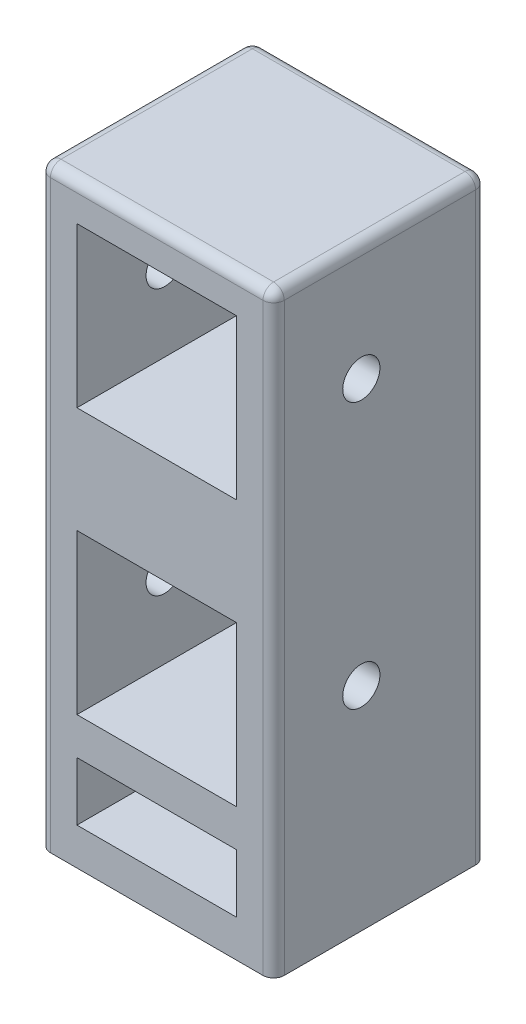
ISO-10303-21;
HEADER;
FILE_DESCRIPTION(('STEP AP214'),'2;1');
FILE_NAME('part.step','',(''),(''),'','','');
FILE_SCHEMA(('AUTOMOTIVE_DESIGN { 1 0 10303 214 1 1 1 1 }'));
ENDSEC;
DATA;
#1=APPLICATION_CONTEXT('core data for automotive mechanical design processes');
#2=APPLICATION_PROTOCOL_DEFINITION('international standard','automotive_design',2000,#1);
#3=PRODUCT_CONTEXT('',#1,'mechanical');
#4=PRODUCT('Part','Part','',(#3));
#5=PRODUCT_RELATED_PRODUCT_CATEGORY('part','',(#4));
#6=PRODUCT_DEFINITION_FORMATION('','',#4);
#7=PRODUCT_DEFINITION_CONTEXT('part definition',#1,'design');
#8=PRODUCT_DEFINITION('design','',#6,#7);
#9=PRODUCT_DEFINITION_SHAPE('','',#8);
#10=(LENGTH_UNIT() NAMED_UNIT(*) SI_UNIT(.MILLI.,.METRE.));
#11=(NAMED_UNIT(*) PLANE_ANGLE_UNIT() SI_UNIT($,.RADIAN.));
#12=(NAMED_UNIT(*) SI_UNIT($,.STERADIAN.) SOLID_ANGLE_UNIT());
#13=UNCERTAINTY_MEASURE_WITH_UNIT(LENGTH_MEASURE(1.E-05),#10,'distance_accuracy_value','');
#14=(GEOMETRIC_REPRESENTATION_CONTEXT(3) GLOBAL_UNCERTAINTY_ASSIGNED_CONTEXT((#13)) GLOBAL_UNIT_ASSIGNED_CONTEXT((#10,
#11,#12)) REPRESENTATION_CONTEXT('',''));
#15=CARTESIAN_POINT('',(0.,0.,0.));
#16=DIRECTION('',(0.,0.,1.));
#17=DIRECTION('',(1.,0.,0.));
#18=AXIS2_PLACEMENT_3D('',#15,#16,#17);
#19=CARTESIAN_POINT('',(0.,0.,20.));
#20=DIRECTION('',(0.,0.,1.));
#21=DIRECTION('',(1.,0.,0.));
#22=AXIS2_PLACEMENT_3D('',#19,#20,#21);
#23=PLANE('',#22);
#24=DIRECTION('',(0.,-1.,0.));
#25=VECTOR('',#24,1.);
#26=CARTESIAN_POINT('',(-21.596172604143,-4.66605227381946,20.));
#27=LINE('',#26,#25);
#28=CARTESIAN_POINT('',(-21.596172604143,-4.66605227381946,20.));
#29=VERTEX_POINT('',#28);
#30=CARTESIAN_POINT('',(-21.596172604143,-10.1660522738195,20.));
#31=VERTEX_POINT('',#30);
#32=EDGE_CURVE('E205',#29,#31,#27,.T.);
#33=ORIENTED_EDGE('',*,*,#32,.F.);
#34=DIRECTION('',(-1.,0.,0.));
#35=VECTOR('',#34,1.);
#36=CARTESIAN_POINT('',(-21.596172604143,-4.66605227381946,20.));
#37=LINE('',#36,#35);
#38=CARTESIAN_POINT('',(-6.59617260414296,-4.66605227381946,20.));
#39=VERTEX_POINT('',#38);
#40=EDGE_CURVE('E209',#39,#29,#37,.T.);
#41=ORIENTED_EDGE('',*,*,#40,.F.);
#42=DIRECTION('',(0.,1.,0.));
#43=VECTOR('',#42,1.);
#44=CARTESIAN_POINT('',(-6.59617260414296,-4.66605227381946,20.));
#45=LINE('',#44,#43);
#46=CARTESIAN_POINT('',(-6.59617260414296,-10.1660522738195,20.));
#47=VERTEX_POINT('',#46);
#48=EDGE_CURVE('E189',#47,#39,#45,.T.);
#49=ORIENTED_EDGE('',*,*,#48,.F.);
#50=DIRECTION('',(1.,0.,0.));
#51=VECTOR('',#50,1.);
#52=CARTESIAN_POINT('',(-21.596172604143,-10.1660522738195,20.));
#53=LINE('',#52,#51);
#54=EDGE_CURVE('E200',#31,#47,#53,.T.);
#55=ORIENTED_EDGE('',*,*,#54,.F.);
#56=EDGE_LOOP('',(#33,#41,#49,#55));
#57=FACE_BOUND('',#56,.T.);
#58=DIRECTION('',(0.,-1.,0.));
#59=VECTOR('',#58,1.);
#60=CARTESIAN_POINT('',(-21.596172604143,13.8339477261805,20.));
#61=LINE('',#60,#59);
#62=CARTESIAN_POINT('',(-21.596172604143,13.8339477261805,20.));
#63=VERTEX_POINT('',#62);
#64=CARTESIAN_POINT('',(-21.596172604143,-1.16605227381946,20.));
#65=VERTEX_POINT('',#64);
#66=EDGE_CURVE('E220',#63,#65,#61,.T.);
#67=ORIENTED_EDGE('',*,*,#66,.F.);
#68=DIRECTION('',(-1.,0.,0.));
#69=VECTOR('',#68,1.);
#70=CARTESIAN_POINT('',(-21.596172604143,13.8339477261805,20.));
#71=LINE('',#70,#69);
#72=CARTESIAN_POINT('',(-6.59617260414296,13.8339477261805,20.));
#73=VERTEX_POINT('',#72);
#74=EDGE_CURVE('E237',#73,#63,#71,.T.);
#75=ORIENTED_EDGE('',*,*,#74,.F.);
#76=DIRECTION('',(0.,1.,0.));
#77=VECTOR('',#76,1.);
#78=CARTESIAN_POINT('',(-6.59617260414296,13.8339477261805,20.));
#79=LINE('',#78,#77);
#80=CARTESIAN_POINT('',(-6.59617260414296,-1.16605227381946,20.));
#81=VERTEX_POINT('',#80);
#82=EDGE_CURVE('E234',#81,#73,#79,.T.);
#83=ORIENTED_EDGE('',*,*,#82,.F.);
#84=DIRECTION('',(1.,0.,0.));
#85=VECTOR('',#84,1.);
#86=CARTESIAN_POINT('',(-21.596172604143,-1.16605227381946,20.));
#87=LINE('',#86,#85);
#88=EDGE_CURVE('E231',#65,#81,#87,.T.);
#89=ORIENTED_EDGE('',*,*,#88,.F.);
#90=EDGE_LOOP('',(#67,#75,#83,#89));
#91=FACE_BOUND('',#90,.T.);
#92=DIRECTION('',(1.,0.,0.));
#93=VECTOR('',#92,1.);
#94=CARTESIAN_POINT('',(-25.096172604143,-13.6660522738195,20.));
#95=LINE('',#94,#93);
#96=CARTESIAN_POINT('',(-24.096172604143,-13.6660522738195,20.));
#97=VERTEX_POINT('',#96);
#98=CARTESIAN_POINT('',(-4.09617260414296,-13.6660522738195,20.));
#99=VERTEX_POINT('',#98);
#100=EDGE_CURVE('E281',#97,#99,#95,.T.);
#101=ORIENTED_EDGE('',*,*,#100,.T.);
#102=DIRECTION('',(0.,1.,0.));
#103=VECTOR('',#102,1.);
#104=CARTESIAN_POINT('',(-4.09617260414297,42.3339477261805,20.));
#105=LINE('',#104,#103);
#106=CARTESIAN_POINT('',(-4.09617260414297,41.3339477261805,20.));
#107=VERTEX_POINT('',#106);
#108=EDGE_CURVE('E317',#99,#107,#105,.T.);
#109=ORIENTED_EDGE('',*,*,#108,.T.);
#110=DIRECTION('',(-1.,0.,0.));
#111=VECTOR('',#110,1.);
#112=CARTESIAN_POINT('',(-25.096172604143,41.3339477261805,20.));
#113=LINE('',#112,#111);
#114=CARTESIAN_POINT('',(-24.096172604143,41.3339477261805,20.));
#115=VERTEX_POINT('',#114);
#116=EDGE_CURVE('E315',#107,#115,#113,.T.);
#117=ORIENTED_EDGE('',*,*,#116,.T.);
#118=DIRECTION('',(0.,-1.,0.));
#119=VECTOR('',#118,1.);
#120=CARTESIAN_POINT('',(-24.096172604143,-13.6660522738195,20.));
#121=LINE('',#120,#119);
#122=EDGE_CURVE('E313',#115,#97,#121,.T.);
#123=ORIENTED_EDGE('',*,*,#122,.T.);
#124=EDGE_LOOP('',(#101,#109,#117,#123));
#125=FACE_BOUND('',#124,.T.);
#126=DIRECTION('',(1.,0.,0.));
#127=VECTOR('',#126,1.);
#128=CARTESIAN_POINT('',(-21.596172604143,23.8339477261805,20.));
#129=LINE('',#128,#127);
#130=CARTESIAN_POINT('',(-21.596172604143,23.8339477261805,20.));
#131=VERTEX_POINT('',#130);
#132=CARTESIAN_POINT('',(-6.59617260414296,23.8339477261805,20.));
#133=VERTEX_POINT('',#132);
#134=EDGE_CURVE('E252',#131,#133,#129,.T.);
#135=ORIENTED_EDGE('',*,*,#134,.F.);
#136=DIRECTION('',(0.,-1.,0.));
#137=VECTOR('',#136,1.);
#138=CARTESIAN_POINT('',(-21.596172604143,38.8339477261805,20.));
#139=LINE('',#138,#137);
#140=CARTESIAN_POINT('',(-21.596172604143,38.8339477261805,20.));
#141=VERTEX_POINT('',#140);
#142=EDGE_CURVE('E250',#141,#131,#139,.T.);
#143=ORIENTED_EDGE('',*,*,#142,.F.);
#144=DIRECTION('',(-1.,0.,0.));
#145=VECTOR('',#144,1.);
#146=CARTESIAN_POINT('',(-21.596172604143,38.8339477261805,20.));
#147=LINE('',#146,#145);
#148=CARTESIAN_POINT('',(-6.59617260414297,38.8339477261805,20.));
#149=VERTEX_POINT('',#148);
#150=EDGE_CURVE('E258',#149,#141,#147,.T.);
#151=ORIENTED_EDGE('',*,*,#150,.F.);
#152=DIRECTION('',(0.,1.,0.));
#153=VECTOR('',#152,1.);
#154=CARTESIAN_POINT('',(-6.59617260414297,38.8339477261805,20.));
#155=LINE('',#154,#153);
#156=EDGE_CURVE('E255',#133,#149,#155,.T.);
#157=ORIENTED_EDGE('',*,*,#156,.F.);
#158=EDGE_LOOP('',(#135,#143,#151,#157));
#159=FACE_BOUND('',#158,.T.);
#160=ADVANCED_FACE('F35',(#57,#91,#125,#159),#23,.T.);
#161=CARTESIAN_POINT('',(0.,0.,0.));
#162=DIRECTION('',(0.,0.,1.));
#163=DIRECTION('',(1.,0.,0.));
#164=AXIS2_PLACEMENT_3D('',#161,#162,#163);
#165=PLANE('',#164);
#166=DIRECTION('',(-1.,0.,0.));
#167=VECTOR('',#166,1.);
#168=CARTESIAN_POINT('',(0.,41.3339477261805,0.));
#169=LINE('',#168,#167);
#170=CARTESIAN_POINT('',(-24.096172604143,41.3339477261805,0.));
#171=VERTEX_POINT('',#170);
#172=CARTESIAN_POINT('',(-4.09617260414297,41.3339477261805,0.));
#173=VERTEX_POINT('',#172);
#174=EDGE_CURVE('E309',#171,#173,#169,.F.);
#175=ORIENTED_EDGE('',*,*,#174,.T.);
#176=DIRECTION('',(0.,1.,0.));
#177=VECTOR('',#176,1.);
#178=CARTESIAN_POINT('',(-4.09617260414296,0.,0.));
#179=LINE('',#178,#177);
#180=CARTESIAN_POINT('',(-4.09617260414296,-13.6660522738195,0.));
#181=VERTEX_POINT('',#180);
#182=EDGE_CURVE('E311',#173,#181,#179,.F.);
#183=ORIENTED_EDGE('',*,*,#182,.T.);
#184=DIRECTION('',(1.,0.,0.));
#185=VECTOR('',#184,1.);
#186=CARTESIAN_POINT('',(-25.096172604143,-13.6660522738195,0.));
#187=LINE('',#186,#185);
#188=CARTESIAN_POINT('',(-24.096172604143,-13.6660522738195,0.));
#189=VERTEX_POINT('',#188);
#190=EDGE_CURVE('E280',#189,#181,#187,.T.);
#191=ORIENTED_EDGE('',*,*,#190,.F.);
#192=DIRECTION('',(0.,-1.,0.));
#193=VECTOR('',#192,1.);
#194=CARTESIAN_POINT('',(-24.096172604143,0.,0.));
#195=LINE('',#194,#193);
#196=EDGE_CURVE('E307',#189,#171,#195,.F.);
#197=ORIENTED_EDGE('',*,*,#196,.T.);
#198=EDGE_LOOP('',(#175,#183,#191,#197));
#199=FACE_BOUND('',#198,.T.);
#200=DIRECTION('',(0.,-1.,0.));
#201=VECTOR('',#200,1.);
#202=CARTESIAN_POINT('',(-21.596172604143,38.8339477261805,0.));
#203=LINE('',#202,#201);
#204=CARTESIAN_POINT('',(-21.596172604143,38.8339477261805,0.));
#205=VERTEX_POINT('',#204);
#206=CARTESIAN_POINT('',(-21.596172604143,23.8339477261805,0.));
#207=VERTEX_POINT('',#206);
#208=EDGE_CURVE('E249',#205,#207,#203,.T.);
#209=ORIENTED_EDGE('',*,*,#208,.T.);
#210=DIRECTION('',(1.,0.,0.));
#211=VECTOR('',#210,1.);
#212=CARTESIAN_POINT('',(-21.596172604143,23.8339477261805,0.));
#213=LINE('',#212,#211);
#214=CARTESIAN_POINT('',(-6.59617260414296,23.8339477261805,0.));
#215=VERTEX_POINT('',#214);
#216=EDGE_CURVE('E263',#207,#215,#213,.T.);
#217=ORIENTED_EDGE('',*,*,#216,.T.);
#218=DIRECTION('',(0.,1.,0.));
#219=VECTOR('',#218,1.);
#220=CARTESIAN_POINT('',(-6.59617260414297,38.8339477261805,0.));
#221=LINE('',#220,#219);
#222=CARTESIAN_POINT('',(-6.59617260414297,38.8339477261805,0.));
#223=VERTEX_POINT('',#222);
#224=EDGE_CURVE('E266',#215,#223,#221,.T.);
#225=ORIENTED_EDGE('',*,*,#224,.T.);
#226=DIRECTION('',(-1.,0.,0.));
#227=VECTOR('',#226,1.);
#228=CARTESIAN_POINT('',(-21.596172604143,38.8339477261805,0.));
#229=LINE('',#228,#227);
#230=EDGE_CURVE('E253',#223,#205,#229,.T.);
#231=ORIENTED_EDGE('',*,*,#230,.T.);
#232=EDGE_LOOP('',(#209,#217,#225,#231));
#233=FACE_BOUND('',#232,.T.);
#234=ADVANCED_FACE('F406',(#199,#233),#165,.F.);
#235=CARTESIAN_POINT('',(-25.096172604143,42.3339477261805,20.));
#236=DIRECTION('',(1.,0.,0.));
#237=DIRECTION('',(0.,0.,-1.));
#238=AXIS2_PLACEMENT_3D('',#235,#236,#237);
#239=PLANE('',#238);
#240=CARTESIAN_POINT('',(-25.096172604143,6.33394772618054,11.75));
#241=DIRECTION('',(-1.,0.,0.));
#242=DIRECTION('',(0.,0.,1.));
#243=AXIS2_PLACEMENT_3D('',#240,#241,#242);
#244=CIRCLE('',#243,1.75);
#245=CARTESIAN_POINT('',(-25.096172604143,6.33394772618054,13.5));
#246=VERTEX_POINT('',#245);
#247=EDGE_CURVE('E777',#246,#246,#244,.T.);
#248=ORIENTED_EDGE('',*,*,#247,.F.);
#249=EDGE_LOOP('',(#248));
#250=FACE_BOUND('',#249,.T.);
#251=CARTESIAN_POINT('',(-25.096172604143,31.3339477261805,11.75));
#252=DIRECTION('',(-1.,0.,0.));
#253=DIRECTION('',(0.,0.,1.));
#254=AXIS2_PLACEMENT_3D('',#251,#252,#253);
#255=CIRCLE('',#254,1.75);
#256=CARTESIAN_POINT('',(-25.096172604143,31.3339477261805,13.5));
#257=VERTEX_POINT('',#256);
#258=EDGE_CURVE('E365',#257,#257,#255,.T.);
#259=ORIENTED_EDGE('',*,*,#258,.F.);
#260=EDGE_LOOP('',(#259));
#261=FACE_BOUND('',#260,.T.);
#262=DIRECTION('',(0.,0.,-1.));
#263=VECTOR('',#262,1.);
#264=CARTESIAN_POINT('',(-25.096172604143,41.3339477261805,20.));
#265=LINE('',#264,#263);
#266=CARTESIAN_POINT('',(-25.096172604143,41.3339477261805,19.));
#267=VERTEX_POINT('',#266);
#268=CARTESIAN_POINT('',(-25.096172604143,41.3339477261805,1.));
#269=VERTEX_POINT('',#268);
#270=EDGE_CURVE('E293',#267,#269,#265,.T.);
#271=ORIENTED_EDGE('',*,*,#270,.T.);
#272=DIRECTION('',(0.,-1.,0.));
#273=VECTOR('',#272,1.);
#274=CARTESIAN_POINT('',(-25.096172604143,42.3339477261805,1.));
#275=LINE('',#274,#273);
#276=CARTESIAN_POINT('',(-25.096172604143,-13.6660522738195,1.));
#277=VERTEX_POINT('',#276);
#278=EDGE_CURVE('E296',#269,#277,#275,.T.);
#279=ORIENTED_EDGE('',*,*,#278,.T.);
#280=DIRECTION('',(0.,0.,-1.));
#281=VECTOR('',#280,1.);
#282=CARTESIAN_POINT('',(-25.096172604143,-13.6660522738195,20.));
#283=LINE('',#282,#281);
#284=CARTESIAN_POINT('',(-25.096172604143,-13.6660522738195,19.));
#285=VERTEX_POINT('',#284);
#286=EDGE_CURVE('E288',#285,#277,#283,.T.);
#287=ORIENTED_EDGE('',*,*,#286,.F.);
#288=DIRECTION('',(0.,-1.,0.));
#289=VECTOR('',#288,1.);
#290=CARTESIAN_POINT('',(-25.096172604143,42.3339477261805,19.));
#291=LINE('',#290,#289);
#292=EDGE_CURVE('E291',#285,#267,#291,.F.);
#293=ORIENTED_EDGE('',*,*,#292,.T.);
#294=EDGE_LOOP('',(#271,#279,#287,#293));
#295=FACE_BOUND('',#294,.T.);
#296=ADVANCED_FACE('F411',(#250,#261,#295),#239,.F.);
#297=CARTESIAN_POINT('',(-25.096172604143,-13.6660522738195,20.));
#298=DIRECTION('',(0.,1.,0.));
#299=DIRECTION('',(0.,0.,1.));
#300=AXIS2_PLACEMENT_3D('',#297,#298,#299);
#301=PLANE('',#300);
#302=ORIENTED_EDGE('',*,*,#190,.T.);
#303=CARTESIAN_POINT('',(-4.09617260414296,-13.6660522738195,1.));
#304=DIRECTION('',(0.,1.,0.));
#305=DIRECTION('',(0.,0.,1.));
#306=AXIS2_PLACEMENT_3D('',#303,#304,#305);
#307=CIRCLE('',#306,1.);
#308=CARTESIAN_POINT('',(-3.09617260414296,-13.6660522738195,1.));
#309=VERTEX_POINT('',#308);
#310=EDGE_CURVE('E12',#181,#309,#307,.F.);
#311=ORIENTED_EDGE('',*,*,#310,.T.);
#312=DIRECTION('',(0.,0.,-1.));
#313=VECTOR('',#312,1.);
#314=CARTESIAN_POINT('',(-3.09617260414296,-13.6660522738195,20.));
#315=LINE('',#314,#313);
#316=CARTESIAN_POINT('',(-3.09617260414296,-13.6660522738195,19.));
#317=VERTEX_POINT('',#316);
#318=EDGE_CURVE('E284',#317,#309,#315,.T.);
#319=ORIENTED_EDGE('',*,*,#318,.F.);
#320=CARTESIAN_POINT('',(-4.09617260414296,-13.6660522738195,19.));
#321=DIRECTION('',(0.,1.,0.));
#322=DIRECTION('',(0.,0.,1.));
#323=AXIS2_PLACEMENT_3D('',#320,#321,#322);
#324=CIRCLE('',#323,1.);
#325=EDGE_CURVE('E44',#317,#99,#324,.F.);
#326=ORIENTED_EDGE('',*,*,#325,.T.);
#327=ORIENTED_EDGE('',*,*,#100,.F.);
#328=CARTESIAN_POINT('',(-24.096172604143,-13.6660522738195,19.));
#329=DIRECTION('',(0.,1.,0.));
#330=DIRECTION('',(0.,0.,1.));
#331=AXIS2_PLACEMENT_3D('',#328,#329,#330);
#332=CIRCLE('',#331,1.);
#333=EDGE_CURVE('E323',#97,#285,#332,.F.);
#334=ORIENTED_EDGE('',*,*,#333,.T.);
#335=ORIENTED_EDGE('',*,*,#286,.T.);
#336=CARTESIAN_POINT('',(-24.096172604143,-13.6660522738195,1.));
#337=DIRECTION('',(0.,1.,0.));
#338=DIRECTION('',(0.,0.,1.));
#339=AXIS2_PLACEMENT_3D('',#336,#337,#338);
#340=CIRCLE('',#339,1.);
#341=EDGE_CURVE('E325',#277,#189,#340,.F.);
#342=ORIENTED_EDGE('',*,*,#341,.T.);
#343=EDGE_LOOP('',(#302,#311,#319,#326,#327,#334,#335,#342));
#344=FACE_BOUND('',#343,.T.);
#345=ADVANCED_FACE('F425',(#344),#301,.F.);
#346=CARTESIAN_POINT('',(-3.09617260414297,42.3339477261805,20.));
#347=DIRECTION('',(-1.,0.,0.));
#348=DIRECTION('',(0.,-1.,0.));
#349=AXIS2_PLACEMENT_3D('',#346,#347,#348);
#350=PLANE('',#349);
#351=CARTESIAN_POINT('',(-3.09617260414296,6.33394772618054,11.75));
#352=DIRECTION('',(-1.,0.,0.));
#353=DIRECTION('',(0.,-1.,0.));
#354=AXIS2_PLACEMENT_3D('',#351,#352,#353);
#355=CIRCLE('',#354,1.75);
#356=CARTESIAN_POINT('',(-3.09617260414296,4.58394772618054,11.75));
#357=VERTEX_POINT('',#356);
#358=EDGE_CURVE('E371',#357,#357,#355,.T.);
#359=ORIENTED_EDGE('',*,*,#358,.T.);
#360=EDGE_LOOP('',(#359));
#361=FACE_BOUND('',#360,.T.);
#362=CARTESIAN_POINT('',(-3.09617260414296,31.3339477261805,11.75));
#363=DIRECTION('',(-1.,0.,0.));
#364=DIRECTION('',(0.,-1.,0.));
#365=AXIS2_PLACEMENT_3D('',#362,#363,#364);
#366=CIRCLE('',#365,1.75);
#367=CARTESIAN_POINT('',(-3.09617260414296,29.5839477261805,11.75));
#368=VERTEX_POINT('',#367);
#369=EDGE_CURVE('E331',#368,#368,#366,.T.);
#370=ORIENTED_EDGE('',*,*,#369,.T.);
#371=EDGE_LOOP('',(#370));
#372=FACE_BOUND('',#371,.T.);
#373=ORIENTED_EDGE('',*,*,#318,.T.);
#374=DIRECTION('',(0.,1.,0.));
#375=VECTOR('',#374,1.);
#376=CARTESIAN_POINT('',(-3.09617260414297,42.3339477261805,1.));
#377=LINE('',#376,#375);
#378=CARTESIAN_POINT('',(-3.09617260414297,41.3339477261805,1.));
#379=VERTEX_POINT('',#378);
#380=EDGE_CURVE('E52',#309,#379,#377,.T.);
#381=ORIENTED_EDGE('',*,*,#380,.T.);
#382=DIRECTION('',(0.,0.,-1.));
#383=VECTOR('',#382,1.);
#384=CARTESIAN_POINT('',(-3.09617260414297,41.3339477261805,20.));
#385=LINE('',#384,#383);
#386=CARTESIAN_POINT('',(-3.09617260414297,41.3339477261805,19.));
#387=VERTEX_POINT('',#386);
#388=EDGE_CURVE('E56',#379,#387,#385,.F.);
#389=ORIENTED_EDGE('',*,*,#388,.T.);
#390=DIRECTION('',(0.,1.,0.));
#391=VECTOR('',#390,1.);
#392=CARTESIAN_POINT('',(-3.09617260414296,-13.6660522738195,19.));
#393=LINE('',#392,#391);
#394=EDGE_CURVE('E319',#387,#317,#393,.F.);
#395=ORIENTED_EDGE('',*,*,#394,.T.);
#396=EDGE_LOOP('',(#373,#381,#389,#395));
#397=FACE_BOUND('',#396,.T.);
#398=ADVANCED_FACE('F421',(#361,#372,#397),#350,.F.);
#399=CARTESIAN_POINT('',(-25.096172604143,42.3339477261805,20.));
#400=DIRECTION('',(0.,-1.,0.));
#401=DIRECTION('',(0.,0.,-1.));
#402=AXIS2_PLACEMENT_3D('',#399,#400,#401);
#403=PLANE('',#402);
#404=DIRECTION('',(-1.,0.,0.));
#405=VECTOR('',#404,1.);
#406=CARTESIAN_POINT('',(-25.096172604143,42.3339477261805,1.));
#407=LINE('',#406,#405);
#408=CARTESIAN_POINT('',(-4.09617260414297,42.3339477261805,1.));
#409=VERTEX_POINT('',#408);
#410=CARTESIAN_POINT('',(-24.096172604143,42.3339477261805,1.));
#411=VERTEX_POINT('',#410);
#412=EDGE_CURVE('E302',#409,#411,#407,.T.);
#413=ORIENTED_EDGE('',*,*,#412,.T.);
#414=DIRECTION('',(0.,0.,-1.));
#415=VECTOR('',#414,1.);
#416=CARTESIAN_POINT('',(-24.096172604143,42.3339477261805,20.));
#417=LINE('',#416,#415);
#418=CARTESIAN_POINT('',(-24.096172604143,42.3339477261805,19.));
#419=VERTEX_POINT('',#418);
#420=EDGE_CURVE('E304',#411,#419,#417,.F.);
#421=ORIENTED_EDGE('',*,*,#420,.T.);
#422=DIRECTION('',(-1.,0.,0.));
#423=VECTOR('',#422,1.);
#424=CARTESIAN_POINT('',(-3.09617260414297,42.3339477261805,19.));
#425=LINE('',#424,#423);
#426=CARTESIAN_POINT('',(-4.09617260414297,42.3339477261805,19.));
#427=VERTEX_POINT('',#426);
#428=EDGE_CURVE('E300',#419,#427,#425,.F.);
#429=ORIENTED_EDGE('',*,*,#428,.T.);
#430=DIRECTION('',(0.,0.,-1.));
#431=VECTOR('',#430,1.);
#432=CARTESIAN_POINT('',(-4.09617260414297,42.3339477261805,20.));
#433=LINE('',#432,#431);
#434=EDGE_CURVE('E298',#427,#409,#433,.T.);
#435=ORIENTED_EDGE('',*,*,#434,.T.);
#436=EDGE_LOOP('',(#413,#421,#429,#435));
#437=FACE_BOUND('',#436,.T.);
#438=ADVANCED_FACE('F418',(#437),#403,.F.);
#439=CARTESIAN_POINT('',(-21.596172604143,38.8339477261805,20.));
#440=DIRECTION('',(1.,0.,0.));
#441=DIRECTION('',(0.,1.,0.));
#442=AXIS2_PLACEMENT_3D('',#439,#440,#441);
#443=PLANE('',#442);
#444=CARTESIAN_POINT('',(-21.596172604143,31.3339477261805,11.75));
#445=DIRECTION('',(1.,0.,0.));
#446=DIRECTION('',(0.,1.,0.));
#447=AXIS2_PLACEMENT_3D('',#444,#445,#446);
#448=CIRCLE('',#447,1.75);
#449=CARTESIAN_POINT('',(-21.596172604143,33.0839477261805,11.75));
#450=VERTEX_POINT('',#449);
#451=EDGE_CURVE('E364',#450,#450,#448,.T.);
#452=ORIENTED_EDGE('',*,*,#451,.F.);
#453=EDGE_LOOP('',(#452));
#454=FACE_BOUND('',#453,.T.);
#455=ORIENTED_EDGE('',*,*,#208,.F.);
#456=DIRECTION('',(0.,0.,-1.));
#457=VECTOR('',#456,1.);
#458=CARTESIAN_POINT('',(-21.596172604143,38.8339477261805,20.));
#459=LINE('',#458,#457);
#460=EDGE_CURVE('E260',#141,#205,#459,.T.);
#461=ORIENTED_EDGE('',*,*,#460,.F.);
#462=ORIENTED_EDGE('',*,*,#142,.T.);
#463=DIRECTION('',(0.,0.,-1.));
#464=VECTOR('',#463,1.);
#465=CARTESIAN_POINT('',(-21.596172604143,23.8339477261805,20.));
#466=LINE('',#465,#464);
#467=EDGE_CURVE('E277',#131,#207,#466,.T.);
#468=ORIENTED_EDGE('',*,*,#467,.T.);
#469=EDGE_LOOP('',(#455,#461,#462,#468));
#470=FACE_BOUND('',#469,.T.);
#471=ADVANCED_FACE('F415',(#454,#470),#443,.T.);
#472=CARTESIAN_POINT('',(-21.596172604143,23.8339477261805,20.));
#473=DIRECTION('',(0.,1.,0.));
#474=DIRECTION('',(0.,0.,1.));
#475=AXIS2_PLACEMENT_3D('',#472,#473,#474);
#476=PLANE('',#475);
#477=ORIENTED_EDGE('',*,*,#216,.F.);
#478=ORIENTED_EDGE('',*,*,#467,.F.);
#479=ORIENTED_EDGE('',*,*,#134,.T.);
#480=DIRECTION('',(0.,0.,-1.));
#481=VECTOR('',#480,1.);
#482=CARTESIAN_POINT('',(-6.59617260414296,23.8339477261805,20.));
#483=LINE('',#482,#481);
#484=EDGE_CURVE('E275',#133,#215,#483,.T.);
#485=ORIENTED_EDGE('',*,*,#484,.T.);
#486=EDGE_LOOP('',(#477,#478,#479,#485));
#487=FACE_BOUND('',#486,.T.);
#488=ADVANCED_FACE('F525',(#487),#476,.T.);
#489=CARTESIAN_POINT('',(-6.59617260414297,38.8339477261805,20.));
#490=DIRECTION('',(-1.,0.,0.));
#491=DIRECTION('',(0.,-1.,0.));
#492=AXIS2_PLACEMENT_3D('',#489,#490,#491);
#493=PLANE('',#492);
#494=CARTESIAN_POINT('',(-6.59617260414297,31.3339477261805,11.75));
#495=DIRECTION('',(-1.,0.,0.));
#496=DIRECTION('',(0.,-1.,0.));
#497=AXIS2_PLACEMENT_3D('',#494,#495,#496);
#498=CIRCLE('',#497,1.75);
#499=CARTESIAN_POINT('',(-6.59617260414297,29.5839477261805,11.75));
#500=VERTEX_POINT('',#499);
#501=EDGE_CURVE('E362',#500,#500,#498,.T.);
#502=ORIENTED_EDGE('',*,*,#501,.F.);
#503=EDGE_LOOP('',(#502));
#504=FACE_BOUND('',#503,.T.);
#505=ORIENTED_EDGE('',*,*,#224,.F.);
#506=ORIENTED_EDGE('',*,*,#484,.F.);
#507=ORIENTED_EDGE('',*,*,#156,.T.);
#508=DIRECTION('',(0.,0.,-1.));
#509=VECTOR('',#508,1.);
#510=CARTESIAN_POINT('',(-6.59617260414297,38.8339477261805,20.));
#511=LINE('',#510,#509);
#512=EDGE_CURVE('E273',#149,#223,#511,.T.);
#513=ORIENTED_EDGE('',*,*,#512,.T.);
#514=EDGE_LOOP('',(#505,#506,#507,#513));
#515=FACE_BOUND('',#514,.T.);
#516=ADVANCED_FACE('F529',(#504,#515),#493,.T.);
#517=CARTESIAN_POINT('',(-21.596172604143,38.8339477261805,20.));
#518=DIRECTION('',(0.,-1.,0.));
#519=DIRECTION('',(0.,0.,-1.));
#520=AXIS2_PLACEMENT_3D('',#517,#518,#519);
#521=PLANE('',#520);
#522=ORIENTED_EDGE('',*,*,#230,.F.);
#523=ORIENTED_EDGE('',*,*,#512,.F.);
#524=ORIENTED_EDGE('',*,*,#150,.T.);
#525=ORIENTED_EDGE('',*,*,#460,.T.);
#526=EDGE_LOOP('',(#522,#523,#524,#525));
#527=FACE_BOUND('',#526,.T.);
#528=ADVANCED_FACE('F520',(#527),#521,.T.);
#529=CARTESIAN_POINT('',(-21.596172604143,13.8339477261805,-21.2132034355964));
#530=DIRECTION('',(-1.,0.,0.));
#531=DIRECTION('',(0.,-1.,0.));
#532=AXIS2_PLACEMENT_3D('',#529,#530,#531);
#533=PLANE('',#532);
#534=CARTESIAN_POINT('',(-21.5961726041429,6.33394772618054,11.75));
#535=DIRECTION('',(-1.,0.,0.));
#536=DIRECTION('',(0.,-1.,0.));
#537=AXIS2_PLACEMENT_3D('',#534,#535,#536);
#538=CIRCLE('',#537,1.75);
#539=CARTESIAN_POINT('',(-21.5961726041429,4.58394772618054,11.75));
#540=VERTEX_POINT('',#539);
#541=EDGE_CURVE('E376',#540,#540,#538,.T.);
#542=ORIENTED_EDGE('',*,*,#541,.T.);
#543=EDGE_LOOP('',(#542));
#544=FACE_BOUND('',#543,.T.);
#545=DIRECTION('',(0.,1.,0.));
#546=VECTOR('',#545,1.);
#547=CARTESIAN_POINT('',(-21.596172604143,13.8339477261805,4.5));
#548=LINE('',#547,#546);
#549=CARTESIAN_POINT('',(-21.596172604143,-1.16605227381946,4.5));
#550=VERTEX_POINT('',#549);
#551=CARTESIAN_POINT('',(-21.596172604143,13.8339477261805,4.5));
#552=VERTEX_POINT('',#551);
#553=EDGE_CURVE('E227',#550,#552,#548,.T.);
#554=ORIENTED_EDGE('',*,*,#553,.T.);
#555=DIRECTION('',(0.,0.,1.));
#556=VECTOR('',#555,1.);
#557=CARTESIAN_POINT('',(-21.596172604143,13.8339477261805,-21.2132034355964));
#558=LINE('',#557,#556);
#559=EDGE_CURVE('E225',#552,#63,#558,.T.);
#560=ORIENTED_EDGE('',*,*,#559,.T.);
#561=ORIENTED_EDGE('',*,*,#66,.T.);
#562=DIRECTION('',(0.,0.,1.));
#563=VECTOR('',#562,1.);
#564=CARTESIAN_POINT('',(-21.596172604143,-1.16605227381946,-21.2132034355964));
#565=LINE('',#564,#563);
#566=EDGE_CURVE('E240',#550,#65,#565,.T.);
#567=ORIENTED_EDGE('',*,*,#566,.F.);
#568=EDGE_LOOP('',(#554,#560,#561,#567));
#569=FACE_BOUND('',#568,.T.);
#570=ADVANCED_FACE('F538',(#544,#569),#533,.F.);
#571=CARTESIAN_POINT('',(-21.596172604143,13.8339477261805,-21.2132034355964));
#572=DIRECTION('',(0.,1.,0.));
#573=DIRECTION('',(0.,0.,1.));
#574=AXIS2_PLACEMENT_3D('',#571,#572,#573);
#575=PLANE('',#574);
#576=DIRECTION('',(1.,0.,0.));
#577=VECTOR('',#576,1.);
#578=CARTESIAN_POINT('',(-21.596172604143,13.8339477261805,4.5));
#579=LINE('',#578,#577);
#580=CARTESIAN_POINT('',(-6.59617260414296,13.8339477261805,4.5));
#581=VERTEX_POINT('',#580);
#582=EDGE_CURVE('E224',#552,#581,#579,.T.);
#583=ORIENTED_EDGE('',*,*,#582,.T.);
#584=DIRECTION('',(0.,0.,1.));
#585=VECTOR('',#584,1.);
#586=CARTESIAN_POINT('',(-6.59617260414296,13.8339477261805,-21.2132034355964));
#587=LINE('',#586,#585);
#588=EDGE_CURVE('E242',#581,#73,#587,.T.);
#589=ORIENTED_EDGE('',*,*,#588,.T.);
#590=ORIENTED_EDGE('',*,*,#74,.T.);
#591=ORIENTED_EDGE('',*,*,#559,.F.);
#592=EDGE_LOOP('',(#583,#589,#590,#591));
#593=FACE_BOUND('',#592,.T.);
#594=ADVANCED_FACE('F543',(#593),#575,.F.);
#595=CARTESIAN_POINT('',(-6.59617260414296,13.8339477261805,-21.2132034355964));
#596=DIRECTION('',(1.,0.,0.));
#597=DIRECTION('',(0.,1.,0.));
#598=AXIS2_PLACEMENT_3D('',#595,#596,#597);
#599=PLANE('',#598);
#600=CARTESIAN_POINT('',(-6.59617260414296,6.33394772618054,11.75));
#601=DIRECTION('',(1.,0.,0.));
#602=DIRECTION('',(0.,1.,0.));
#603=AXIS2_PLACEMENT_3D('',#600,#601,#602);
#604=CIRCLE('',#603,1.75);
#605=CARTESIAN_POINT('',(-6.59617260414296,8.08394772618054,11.75));
#606=VERTEX_POINT('',#605);
#607=EDGE_CURVE('E39',#606,#606,#604,.T.);
#608=ORIENTED_EDGE('',*,*,#607,.T.);
#609=EDGE_LOOP('',(#608));
#610=FACE_BOUND('',#609,.T.);
#611=DIRECTION('',(0.,-1.,0.));
#612=VECTOR('',#611,1.);
#613=CARTESIAN_POINT('',(-6.59617260414296,13.8339477261805,4.5));
#614=LINE('',#613,#612);
#615=CARTESIAN_POINT('',(-6.59617260414296,-1.16605227381946,4.5));
#616=VERTEX_POINT('',#615);
#617=EDGE_CURVE('E222',#581,#616,#614,.T.);
#618=ORIENTED_EDGE('',*,*,#617,.T.);
#619=DIRECTION('',(0.,0.,1.));
#620=VECTOR('',#619,1.);
#621=CARTESIAN_POINT('',(-6.59617260414296,-1.16605227381946,-21.2132034355964));
#622=LINE('',#621,#620);
#623=EDGE_CURVE('E244',#616,#81,#622,.T.);
#624=ORIENTED_EDGE('',*,*,#623,.T.);
#625=ORIENTED_EDGE('',*,*,#82,.T.);
#626=ORIENTED_EDGE('',*,*,#588,.F.);
#627=EDGE_LOOP('',(#618,#624,#625,#626));
#628=FACE_BOUND('',#627,.T.);
#629=ADVANCED_FACE('F549',(#610,#628),#599,.F.);
#630=CARTESIAN_POINT('',(-21.596172604143,-1.16605227381946,-21.2132034355964));
#631=DIRECTION('',(0.,-1.,0.));
#632=DIRECTION('',(0.,0.,-1.));
#633=AXIS2_PLACEMENT_3D('',#630,#631,#632);
#634=PLANE('',#633);
#635=DIRECTION('',(-1.,0.,0.));
#636=VECTOR('',#635,1.);
#637=CARTESIAN_POINT('',(-21.596172604143,-1.16605227381946,4.5));
#638=LINE('',#637,#636);
#639=EDGE_CURVE('E229',#616,#550,#638,.T.);
#640=ORIENTED_EDGE('',*,*,#639,.T.);
#641=ORIENTED_EDGE('',*,*,#566,.T.);
#642=ORIENTED_EDGE('',*,*,#88,.T.);
#643=ORIENTED_EDGE('',*,*,#623,.F.);
#644=EDGE_LOOP('',(#640,#641,#642,#643));
#645=FACE_BOUND('',#644,.T.);
#646=ADVANCED_FACE('F545',(#645),#634,.F.);
#647=CARTESIAN_POINT('',(0.,0.,4.5));
#648=DIRECTION('',(0.,0.,1.));
#649=DIRECTION('',(1.,0.,0.));
#650=AXIS2_PLACEMENT_3D('',#647,#648,#649);
#651=PLANE('',#650);
#652=ORIENTED_EDGE('',*,*,#553,.F.);
#653=ORIENTED_EDGE('',*,*,#639,.F.);
#654=ORIENTED_EDGE('',*,*,#617,.F.);
#655=ORIENTED_EDGE('',*,*,#582,.F.);
#656=EDGE_LOOP('',(#652,#653,#654,#655));
#657=FACE_BOUND('',#656,.T.);
#658=ADVANCED_FACE('F548',(#657),#651,.T.);
#659=CARTESIAN_POINT('',(-21.596172604143,-4.66605227381946,-21.2132034355964));
#660=DIRECTION('',(-1.,0.,0.));
#661=DIRECTION('',(0.,0.,1.));
#662=AXIS2_PLACEMENT_3D('',#659,#660,#661);
#663=PLANE('',#662);
#664=DIRECTION('',(0.,1.,0.));
#665=VECTOR('',#664,1.);
#666=CARTESIAN_POINT('',(-21.596172604143,-4.66605227381946,4.5));
#667=LINE('',#666,#665);
#668=CARTESIAN_POINT('',(-21.596172604143,-10.1660522738195,4.5));
#669=VERTEX_POINT('',#668);
#670=CARTESIAN_POINT('',(-21.596172604143,-4.66605227381946,4.5));
#671=VERTEX_POINT('',#670);
#672=EDGE_CURVE('E221',#669,#671,#667,.T.);
#673=ORIENTED_EDGE('',*,*,#672,.T.);
#674=DIRECTION('',(0.,0.,1.));
#675=VECTOR('',#674,1.);
#676=CARTESIAN_POINT('',(-21.596172604143,-4.66605227381946,-21.2132034355964));
#677=LINE('',#676,#675);
#678=EDGE_CURVE('E214',#671,#29,#677,.T.);
#679=ORIENTED_EDGE('',*,*,#678,.T.);
#680=ORIENTED_EDGE('',*,*,#32,.T.);
#681=DIRECTION('',(0.,0.,1.));
#682=VECTOR('',#681,1.);
#683=CARTESIAN_POINT('',(-21.596172604143,-10.1660522738195,-21.2132034355964));
#684=LINE('',#683,#682);
#685=EDGE_CURVE('E196',#669,#31,#684,.T.);
#686=ORIENTED_EDGE('',*,*,#685,.F.);
#687=EDGE_LOOP('',(#673,#679,#680,#686));
#688=FACE_BOUND('',#687,.T.);
#689=ADVANCED_FACE('F386',(#688),#663,.F.);
#690=CARTESIAN_POINT('',(-21.596172604143,-4.66605227381946,-21.2132034355964));
#691=DIRECTION('',(0.,1.,0.));
#692=DIRECTION('',(0.,0.,1.));
#693=AXIS2_PLACEMENT_3D('',#690,#691,#692);
#694=PLANE('',#693);
#695=DIRECTION('',(1.,0.,0.));
#696=VECTOR('',#695,1.);
#697=CARTESIAN_POINT('',(-21.596172604143,-4.66605227381946,4.5));
#698=LINE('',#697,#696);
#699=CARTESIAN_POINT('',(-6.59617260414296,-4.66605227381946,4.5));
#700=VERTEX_POINT('',#699);
#701=EDGE_CURVE('E383',#671,#700,#698,.T.);
#702=ORIENTED_EDGE('',*,*,#701,.T.);
#703=DIRECTION('',(0.,0.,1.));
#704=VECTOR('',#703,1.);
#705=CARTESIAN_POINT('',(-6.59617260414296,-4.66605227381946,-21.2132034355964));
#706=LINE('',#705,#704);
#707=EDGE_CURVE('E195',#700,#39,#706,.T.);
#708=ORIENTED_EDGE('',*,*,#707,.T.);
#709=ORIENTED_EDGE('',*,*,#40,.T.);
#710=ORIENTED_EDGE('',*,*,#678,.F.);
#711=EDGE_LOOP('',(#702,#708,#709,#710));
#712=FACE_BOUND('',#711,.T.);
#713=ADVANCED_FACE('F391',(#712),#694,.F.);
#714=CARTESIAN_POINT('',(-6.59617260414296,-4.66605227381946,-21.2132034355964));
#715=DIRECTION('',(1.,0.,0.));
#716=DIRECTION('',(0.,1.,0.));
#717=AXIS2_PLACEMENT_3D('',#714,#715,#716);
#718=PLANE('',#717);
#719=DIRECTION('',(0.,-1.,0.));
#720=VECTOR('',#719,1.);
#721=CARTESIAN_POINT('',(-6.59617260414296,-4.66605227381946,4.5));
#722=LINE('',#721,#720);
#723=CARTESIAN_POINT('',(-6.59617260414296,-10.1660522738195,4.5));
#724=VERTEX_POINT('',#723);
#725=EDGE_CURVE('E192',#700,#724,#722,.T.);
#726=ORIENTED_EDGE('',*,*,#725,.T.);
#727=DIRECTION('',(0.,0.,1.));
#728=VECTOR('',#727,1.);
#729=CARTESIAN_POINT('',(-6.59617260414296,-10.1660522738195,-21.2132034355964));
#730=LINE('',#729,#728);
#731=EDGE_CURVE('E184',#724,#47,#730,.T.);
#732=ORIENTED_EDGE('',*,*,#731,.T.);
#733=ORIENTED_EDGE('',*,*,#48,.T.);
#734=ORIENTED_EDGE('',*,*,#707,.F.);
#735=EDGE_LOOP('',(#726,#732,#733,#734));
#736=FACE_BOUND('',#735,.T.);
#737=ADVANCED_FACE('F186',(#736),#718,.F.);
#738=CARTESIAN_POINT('',(-21.596172604143,-10.1660522738195,-21.2132034355964));
#739=DIRECTION('',(0.,-1.,0.));
#740=DIRECTION('',(0.,0.,-1.));
#741=AXIS2_PLACEMENT_3D('',#738,#739,#740);
#742=PLANE('',#741);
#743=DIRECTION('',(-1.,0.,0.));
#744=VECTOR('',#743,1.);
#745=CARTESIAN_POINT('',(-21.596172604143,-10.1660522738195,4.5));
#746=LINE('',#745,#744);
#747=EDGE_CURVE('E218',#724,#669,#746,.T.);
#748=ORIENTED_EDGE('',*,*,#747,.T.);
#749=ORIENTED_EDGE('',*,*,#685,.T.);
#750=ORIENTED_EDGE('',*,*,#54,.T.);
#751=ORIENTED_EDGE('',*,*,#731,.F.);
#752=EDGE_LOOP('',(#748,#749,#750,#751));
#753=FACE_BOUND('',#752,.T.);
#754=ADVANCED_FACE('F201',(#753),#742,.F.);
#755=CARTESIAN_POINT('',(0.,0.,4.5));
#756=DIRECTION('',(0.,0.,1.));
#757=DIRECTION('',(1.,0.,0.));
#758=AXIS2_PLACEMENT_3D('',#755,#756,#757);
#759=PLANE('',#758);
#760=ORIENTED_EDGE('',*,*,#672,.F.);
#761=ORIENTED_EDGE('',*,*,#747,.F.);
#762=ORIENTED_EDGE('',*,*,#725,.F.);
#763=ORIENTED_EDGE('',*,*,#701,.F.);
#764=EDGE_LOOP('',(#760,#761,#762,#763));
#765=FACE_BOUND('',#764,.T.);
#766=ADVANCED_FACE('F393',(#765),#759,.T.);
#767=CARTESIAN_POINT('',(-4.09617260414296,0.,19.));
#768=DIRECTION('',(0.,-1.,0.));
#769=DIRECTION('',(1.,0.,0.));
#770=AXIS2_PLACEMENT_3D('',#767,#768,#769);
#771=CYLINDRICAL_SURFACE('',#770,1.);
#772=ORIENTED_EDGE('',*,*,#325,.F.);
#773=ORIENTED_EDGE('',*,*,#394,.F.);
#774=CARTESIAN_POINT('',(-4.09617260414297,41.3339477261805,19.));
#775=DIRECTION('',(0.,1.,0.));
#776=DIRECTION('',(0.,0.,1.));
#777=AXIS2_PLACEMENT_3D('',#774,#775,#776);
#778=CIRCLE('',#777,1.);
#779=EDGE_CURVE('E357',#107,#387,#778,.T.);
#780=ORIENTED_EDGE('',*,*,#779,.F.);
#781=ORIENTED_EDGE('',*,*,#108,.F.);
#782=EDGE_LOOP('',(#772,#773,#780,#781));
#783=FACE_BOUND('',#782,.T.);
#784=ADVANCED_FACE('F37',(#783),#771,.T.);
#785=CARTESIAN_POINT('',(-4.09617260414297,42.3339477261805,1.));
#786=DIRECTION('',(0.,1.,0.));
#787=DIRECTION('',(-1.,0.,0.));
#788=AXIS2_PLACEMENT_3D('',#785,#786,#787);
#789=CYLINDRICAL_SURFACE('',#788,1.);
#790=ORIENTED_EDGE('',*,*,#310,.F.);
#791=ORIENTED_EDGE('',*,*,#182,.F.);
#792=CARTESIAN_POINT('',(-4.09617260414297,41.3339477261805,1.));
#793=DIRECTION('',(0.,1.,0.));
#794=DIRECTION('',(0.,0.,1.));
#795=AXIS2_PLACEMENT_3D('',#792,#793,#794);
#796=CIRCLE('',#795,1.);
#797=EDGE_CURVE('E354',#379,#173,#796,.T.);
#798=ORIENTED_EDGE('',*,*,#797,.F.);
#799=ORIENTED_EDGE('',*,*,#380,.F.);
#800=EDGE_LOOP('',(#790,#791,#798,#799));
#801=FACE_BOUND('',#800,.T.);
#802=ADVANCED_FACE('F400',(#801),#789,.T.);
#803=CARTESIAN_POINT('',(-4.09617260414297,41.3339477261805,20.));
#804=DIRECTION('',(0.,0.,-1.));
#805=DIRECTION('',(-1.,0.,0.));
#806=AXIS2_PLACEMENT_3D('',#803,#804,#805);
#807=CYLINDRICAL_SURFACE('',#806,1.);
#808=CARTESIAN_POINT('',(-4.09617260414297,41.3339477261805,19.));
#809=DIRECTION('',(0.,0.,1.));
#810=DIRECTION('',(1.,0.,0.));
#811=AXIS2_PLACEMENT_3D('',#808,#809,#810);
#812=CIRCLE('',#811,1.);
#813=EDGE_CURVE('E360',#387,#427,#812,.T.);
#814=ORIENTED_EDGE('',*,*,#813,.F.);
#815=ORIENTED_EDGE('',*,*,#388,.F.);
#816=CARTESIAN_POINT('',(-4.09617260414297,41.3339477261805,1.));
#817=DIRECTION('',(0.,0.,-1.));
#818=DIRECTION('',(-1.,0.,0.));
#819=AXIS2_PLACEMENT_3D('',#816,#817,#818);
#820=CIRCLE('',#819,1.);
#821=EDGE_CURVE('E351',#409,#379,#820,.T.);
#822=ORIENTED_EDGE('',*,*,#821,.F.);
#823=ORIENTED_EDGE('',*,*,#434,.F.);
#824=EDGE_LOOP('',(#814,#815,#822,#823));
#825=FACE_BOUND('',#824,.T.);
#826=ADVANCED_FACE('F469',(#825),#807,.T.);
#827=CARTESIAN_POINT('',(-4.09617260414297,41.3339477261805,19.));
#828=DIRECTION('',(0.,0.,1.));
#829=DIRECTION('',(1.,0.,0.));
#830=AXIS2_PLACEMENT_3D('',#827,#828,#829);
#831=SPHERICAL_SURFACE('',#830,1.);
#832=ORIENTED_EDGE('',*,*,#779,.T.);
#833=ORIENTED_EDGE('',*,*,#813,.T.);
#834=CARTESIAN_POINT('',(-4.09617260414297,41.3339477261805,19.));
#835=DIRECTION('',(1.,0.,0.));
#836=DIRECTION('',(0.,0.,-1.));
#837=AXIS2_PLACEMENT_3D('',#834,#835,#836);
#838=CIRCLE('',#837,1.);
#839=EDGE_CURVE('E348',#107,#427,#838,.F.);
#840=ORIENTED_EDGE('',*,*,#839,.F.);
#841=EDGE_LOOP('',(#832,#833,#840));
#842=FACE_BOUND('',#841,.T.);
#843=ADVANCED_FACE('F465',(#842),#831,.T.);
#844=CARTESIAN_POINT('',(-4.09617260414297,41.3339477261805,1.));
#845=DIRECTION('',(0.,0.,1.));
#846=DIRECTION('',(1.,0.,0.));
#847=AXIS2_PLACEMENT_3D('',#844,#845,#846);
#848=SPHERICAL_SURFACE('',#847,1.);
#849=ORIENTED_EDGE('',*,*,#821,.T.);
#850=ORIENTED_EDGE('',*,*,#797,.T.);
#851=CARTESIAN_POINT('',(-4.09617260414297,41.3339477261805,1.));
#852=DIRECTION('',(1.,0.,0.));
#853=DIRECTION('',(0.,1.,0.));
#854=AXIS2_PLACEMENT_3D('',#851,#852,#853);
#855=CIRCLE('',#854,1.);
#856=EDGE_CURVE('E345',#409,#173,#855,.F.);
#857=ORIENTED_EDGE('',*,*,#856,.F.);
#858=EDGE_LOOP('',(#849,#850,#857));
#859=FACE_BOUND('',#858,.T.);
#860=ADVANCED_FACE('F461',(#859),#848,.T.);
#861=CARTESIAN_POINT('',(0.,41.3339477261805,19.));
#862=DIRECTION('',(1.,0.,0.));
#863=DIRECTION('',(0.,0.,-1.));
#864=AXIS2_PLACEMENT_3D('',#861,#862,#863);
#865=CYLINDRICAL_SURFACE('',#864,1.);
#866=ORIENTED_EDGE('',*,*,#839,.T.);
#867=ORIENTED_EDGE('',*,*,#428,.F.);
#868=CARTESIAN_POINT('',(-24.096172604143,41.3339477261805,19.));
#869=DIRECTION('',(-1.,0.,0.));
#870=DIRECTION('',(0.,0.,1.));
#871=AXIS2_PLACEMENT_3D('',#868,#869,#870);
#872=CIRCLE('',#871,1.);
#873=EDGE_CURVE('E342',#115,#419,#872,.T.);
#874=ORIENTED_EDGE('',*,*,#873,.F.);
#875=ORIENTED_EDGE('',*,*,#116,.F.);
#876=EDGE_LOOP('',(#866,#867,#874,#875));
#877=FACE_BOUND('',#876,.T.);
#878=ADVANCED_FACE('F457',(#877),#865,.T.);
#879=CARTESIAN_POINT('',(-24.096172604143,0.,19.));
#880=DIRECTION('',(0.,1.,0.));
#881=DIRECTION('',(0.,0.,1.));
#882=AXIS2_PLACEMENT_3D('',#879,#880,#881);
#883=CYLINDRICAL_SURFACE('',#882,1.);
#884=ORIENTED_EDGE('',*,*,#333,.F.);
#885=ORIENTED_EDGE('',*,*,#122,.F.);
#886=CARTESIAN_POINT('',(-24.096172604143,41.3339477261805,19.));
#887=DIRECTION('',(0.,1.,0.));
#888=DIRECTION('',(0.,0.,1.));
#889=AXIS2_PLACEMENT_3D('',#886,#887,#888);
#890=CIRCLE('',#889,1.);
#891=EDGE_CURVE('E339',#267,#115,#890,.T.);
#892=ORIENTED_EDGE('',*,*,#891,.F.);
#893=ORIENTED_EDGE('',*,*,#292,.F.);
#894=EDGE_LOOP('',(#884,#885,#892,#893));
#895=FACE_BOUND('',#894,.T.);
#896=ADVANCED_FACE('F453',(#895),#883,.T.);
#897=CARTESIAN_POINT('',(-24.096172604143,42.3339477261805,1.));
#898=DIRECTION('',(0.,-1.,0.));
#899=DIRECTION('',(0.,0.,-1.));
#900=AXIS2_PLACEMENT_3D('',#897,#898,#899);
#901=CYLINDRICAL_SURFACE('',#900,1.);
#902=ORIENTED_EDGE('',*,*,#341,.F.);
#903=ORIENTED_EDGE('',*,*,#278,.F.);
#904=CARTESIAN_POINT('',(-24.096172604143,41.3339477261805,1.));
#905=DIRECTION('',(0.,1.,0.));
#906=DIRECTION('',(0.,0.,1.));
#907=AXIS2_PLACEMENT_3D('',#904,#905,#906);
#908=CIRCLE('',#907,1.);
#909=EDGE_CURVE('E336',#171,#269,#908,.T.);
#910=ORIENTED_EDGE('',*,*,#909,.F.);
#911=ORIENTED_EDGE('',*,*,#196,.F.);
#912=EDGE_LOOP('',(#902,#903,#910,#911));
#913=FACE_BOUND('',#912,.T.);
#914=ADVANCED_FACE('F449',(#913),#901,.T.);
#915=CARTESIAN_POINT('',(-25.096172604143,41.3339477261805,1.));
#916=DIRECTION('',(-1.,0.,0.));
#917=DIRECTION('',(0.,0.,1.));
#918=AXIS2_PLACEMENT_3D('',#915,#916,#917);
#919=CYLINDRICAL_SURFACE('',#918,1.);
#920=ORIENTED_EDGE('',*,*,#856,.T.);
#921=ORIENTED_EDGE('',*,*,#174,.F.);
#922=CARTESIAN_POINT('',(-24.096172604143,41.3339477261805,1.));
#923=DIRECTION('',(-1.,0.,0.));
#924=DIRECTION('',(0.,0.,1.));
#925=AXIS2_PLACEMENT_3D('',#922,#923,#924);
#926=CIRCLE('',#925,1.);
#927=EDGE_CURVE('E333',#411,#171,#926,.T.);
#928=ORIENTED_EDGE('',*,*,#927,.F.);
#929=ORIENTED_EDGE('',*,*,#412,.F.);
#930=EDGE_LOOP('',(#920,#921,#928,#929));
#931=FACE_BOUND('',#930,.T.);
#932=ADVANCED_FACE('F445',(#931),#919,.T.);
#933=CARTESIAN_POINT('',(-24.096172604143,41.3339477261805,19.));
#934=DIRECTION('',(0.,0.,1.));
#935=DIRECTION('',(1.,0.,0.));
#936=AXIS2_PLACEMENT_3D('',#933,#934,#935);
#937=SPHERICAL_SURFACE('',#936,1.);
#938=ORIENTED_EDGE('',*,*,#891,.T.);
#939=ORIENTED_EDGE('',*,*,#873,.T.);
#940=CARTESIAN_POINT('',(-24.096172604143,41.3339477261805,19.));
#941=DIRECTION('',(0.,0.,1.));
#942=DIRECTION('',(1.,0.,0.));
#943=AXIS2_PLACEMENT_3D('',#940,#941,#942);
#944=CIRCLE('',#943,1.);
#945=EDGE_CURVE('E330',#267,#419,#944,.F.);
#946=ORIENTED_EDGE('',*,*,#945,.F.);
#947=EDGE_LOOP('',(#938,#939,#946));
#948=FACE_BOUND('',#947,.T.);
#949=ADVANCED_FACE('F441',(#948),#937,.T.);
#950=CARTESIAN_POINT('',(-24.096172604143,41.3339477261805,1.));
#951=DIRECTION('',(0.,0.,1.));
#952=DIRECTION('',(1.,0.,0.));
#953=AXIS2_PLACEMENT_3D('',#950,#951,#952);
#954=SPHERICAL_SURFACE('',#953,1.);
#955=ORIENTED_EDGE('',*,*,#927,.T.);
#956=ORIENTED_EDGE('',*,*,#909,.T.);
#957=CARTESIAN_POINT('',(-24.096172604143,41.3339477261805,1.));
#958=DIRECTION('',(0.,0.,-1.));
#959=DIRECTION('',(-1.,0.,0.));
#960=AXIS2_PLACEMENT_3D('',#957,#958,#959);
#961=CIRCLE('',#960,1.);
#962=EDGE_CURVE('E328',#411,#269,#961,.F.);
#963=ORIENTED_EDGE('',*,*,#962,.F.);
#964=EDGE_LOOP('',(#955,#956,#963));
#965=FACE_BOUND('',#964,.T.);
#966=ADVANCED_FACE('F437',(#965),#954,.T.);
#967=CARTESIAN_POINT('',(-24.096172604143,41.3339477261805,20.));
#968=DIRECTION('',(0.,0.,-1.));
#969=DIRECTION('',(-1.,0.,0.));
#970=AXIS2_PLACEMENT_3D('',#967,#968,#969);
#971=CYLINDRICAL_SURFACE('',#970,1.);
#972=ORIENTED_EDGE('',*,*,#945,.T.);
#973=ORIENTED_EDGE('',*,*,#420,.F.);
#974=ORIENTED_EDGE('',*,*,#962,.T.);
#975=ORIENTED_EDGE('',*,*,#270,.F.);
#976=EDGE_LOOP('',(#972,#973,#974,#975));
#977=FACE_BOUND('',#976,.T.);
#978=ADVANCED_FACE('F433',(#977),#971,.T.);
#979=CARTESIAN_POINT('',(9.90382739585705,31.3339477261805,11.75));
#980=DIRECTION('',(-1.,0.,0.));
#981=DIRECTION('',(0.,0.,1.));
#982=AXIS2_PLACEMENT_3D('',#979,#980,#981);
#983=CYLINDRICAL_SURFACE('',#982,1.75);
#984=ORIENTED_EDGE('',*,*,#501,.T.);
#985=EDGE_LOOP('',(#984));
#986=FACE_BOUND('',#985,.T.);
#987=ORIENTED_EDGE('',*,*,#369,.F.);
#988=EDGE_LOOP('',(#987));
#989=FACE_BOUND('',#988,.T.);
#990=ADVANCED_FACE('F436',(#986,#989),#983,.F.);
#991=ORIENTED_EDGE('',*,*,#451,.T.);
#992=EDGE_LOOP('',(#991));
#993=FACE_BOUND('',#992,.T.);
#994=ORIENTED_EDGE('',*,*,#258,.T.);
#995=EDGE_LOOP('',(#994));
#996=FACE_BOUND('',#995,.T.);
#997=ADVANCED_FACE('F744',(#993,#996),#983,.F.);
#998=CARTESIAN_POINT('',(9.90382739585705,6.33394772618054,11.75));
#999=DIRECTION('',(-1.,0.,0.));
#1000=DIRECTION('',(0.,0.,1.));
#1001=AXIS2_PLACEMENT_3D('',#998,#999,#1000);
#1002=CYLINDRICAL_SURFACE('',#1001,1.75);
#1003=ORIENTED_EDGE('',*,*,#607,.F.);
#1004=EDGE_LOOP('',(#1003));
#1005=FACE_BOUND('',#1004,.T.);
#1006=ORIENTED_EDGE('',*,*,#358,.F.);
#1007=EDGE_LOOP('',(#1006));
#1008=FACE_BOUND('',#1007,.T.);
#1009=ADVANCED_FACE('F752',(#1005,#1008),#1002,.F.);
#1010=ORIENTED_EDGE('',*,*,#247,.T.);
#1011=EDGE_LOOP('',(#1010));
#1012=FACE_BOUND('',#1011,.T.);
#1013=ORIENTED_EDGE('',*,*,#541,.F.);
#1014=EDGE_LOOP('',(#1013));
#1015=FACE_BOUND('',#1014,.T.);
#1016=ADVANCED_FACE('F761',(#1012,#1015),#1002,.F.);
#1017=CLOSED_SHELL('',(#160,#234,#296,#345,#398,#438,#471,#488,#516,#528,#570,#594,#629,#646,
#658,#689,#713,#737,#754,#766,#784,#802,#826,#843,#860,#878,#896,#914,#932,#949,#966,#978,#990,
#997,#1009,#1016));
#1018=MANIFOLD_SOLID_BREP('B2',#1017);
#1019=ADVANCED_BREP_SHAPE_REPRESENTATION('',(#18,#1018),#14);
#1020=SHAPE_DEFINITION_REPRESENTATION(#9,#1019);
ENDSEC;
END-ISO-10303-21;
